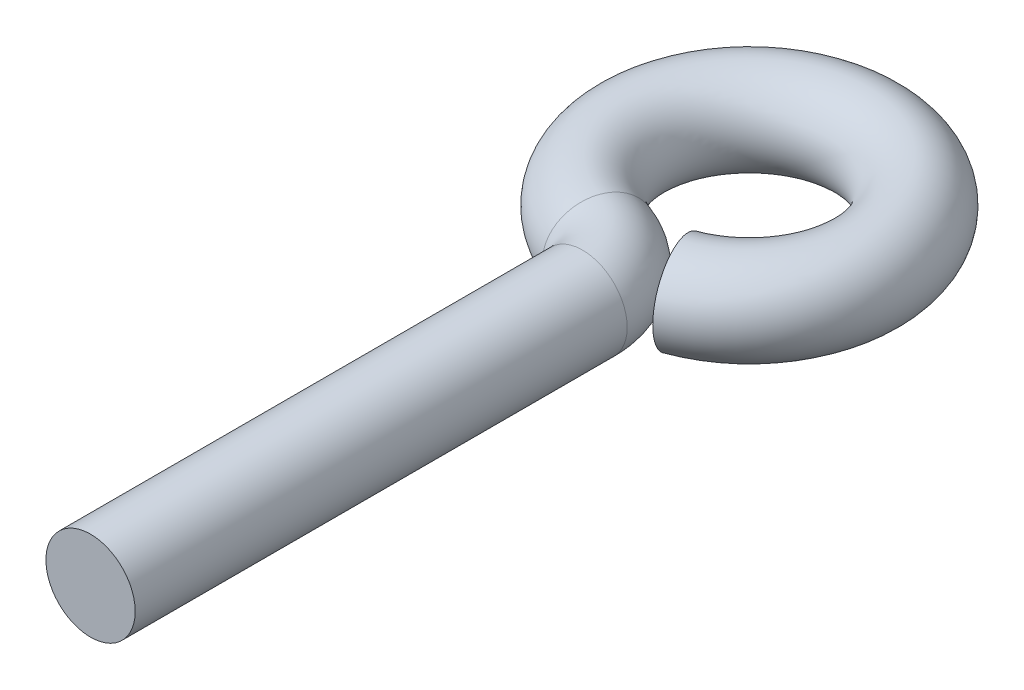
ISO-10303-21;
HEADER;
FILE_DESCRIPTION(('STEP AP214'),'2;1');
FILE_NAME('part.step','',(''),(''),'','','');
FILE_SCHEMA(('AUTOMOTIVE_DESIGN { 1 0 10303 214 1 1 1 1 }'));
ENDSEC;
DATA;
#1=APPLICATION_CONTEXT('core data for automotive mechanical design processes');
#2=APPLICATION_PROTOCOL_DEFINITION('international standard','automotive_design',2000,#1);
#3=PRODUCT_CONTEXT('',#1,'mechanical');
#4=PRODUCT('Part','Part','',(#3));
#5=PRODUCT_RELATED_PRODUCT_CATEGORY('part','',(#4));
#6=PRODUCT_DEFINITION_FORMATION('','',#4);
#7=PRODUCT_DEFINITION_CONTEXT('part definition',#1,'design');
#8=PRODUCT_DEFINITION('design','',#6,#7);
#9=PRODUCT_DEFINITION_SHAPE('','',#8);
#10=(LENGTH_UNIT() NAMED_UNIT(*) SI_UNIT(.MILLI.,.METRE.));
#11=(NAMED_UNIT(*) PLANE_ANGLE_UNIT() SI_UNIT($,.RADIAN.));
#12=(NAMED_UNIT(*) SI_UNIT($,.STERADIAN.) SOLID_ANGLE_UNIT());
#13=UNCERTAINTY_MEASURE_WITH_UNIT(LENGTH_MEASURE(1.E-05),#10,'distance_accuracy_value','');
#14=(GEOMETRIC_REPRESENTATION_CONTEXT(3) GLOBAL_UNCERTAINTY_ASSIGNED_CONTEXT((#13)) GLOBAL_UNIT_ASSIGNED_CONTEXT((#10,
#11,#12)) REPRESENTATION_CONTEXT('',''));
#15=CARTESIAN_POINT('',(0.,0.,0.));
#16=DIRECTION('',(0.,0.,1.));
#17=DIRECTION('',(1.,0.,0.));
#18=AXIS2_PLACEMENT_3D('',#15,#16,#17);
#19=CARTESIAN_POINT('',(1.65879769512947,0.,4.55750921081167));
#20=DIRECTION('',(0.93969262078591,0.,-0.342020143325663));
#21=DIRECTION('',(-0.342020143325663,0.,-0.93969262078591));
#22=AXIS2_PLACEMENT_3D('',#19,#20,#21);
#23=PLANE('',#22);
#24=CARTESIAN_POINT('',(1.65879769512947,0.,4.55750921081167));
#25=DIRECTION('',(0.93969262078591,0.,-0.342020143325663));
#26=DIRECTION('',(-0.342020143325663,0.,-0.93969262078591));
#27=AXIS2_PLACEMENT_3D('',#24,#25,#26);
#28=CIRCLE('',#27,1.85);
#29=CARTESIAN_POINT('',(2.29153496028195,0.,6.2959405592656));
#30=VERTEX_POINT('',#29);
#31=EDGE_CURVE('E46',#30,#30,#28,.T.);
#32=ORIENTED_EDGE('',*,*,#31,.F.);
#33=EDGE_LOOP('',(#32));
#34=FACE_BOUND('',#33,.T.);
#35=ADVANCED_FACE('F32',(#34),#23,.F.);
#36=CARTESIAN_POINT('',(0.,0.,27.3));
#37=DIRECTION('',(0.,0.,1.));
#38=DIRECTION('',(1.,0.,0.));
#39=AXIS2_PLACEMENT_3D('',#36,#37,#38);
#40=PLANE('',#39);
#41=CARTESIAN_POINT('',(0.,0.,27.3));
#42=DIRECTION('',(0.,0.,1.));
#43=DIRECTION('',(1.,0.,0.));
#44=AXIS2_PLACEMENT_3D('',#41,#42,#43);
#45=CIRCLE('',#44,1.85);
#46=CARTESIAN_POINT('',(1.85,0.,27.3));
#47=VERTEX_POINT('',#46);
#48=EDGE_CURVE('E10',#47,#47,#45,.T.);
#49=ORIENTED_EDGE('',*,*,#48,.T.);
#50=EDGE_LOOP('',(#49));
#51=FACE_BOUND('',#50,.T.);
#52=ADVANCED_FACE('F55',(#51),#40,.T.);
#53=CARTESIAN_POINT('',(0.,0.,0.));
#54=DIRECTION('',(0.,1.,0.));
#55=DIRECTION('',(0.,0.,1.));
#56=AXIS2_PLACEMENT_3D('',#53,#54,#55);
#57=TOROIDAL_SURFACE('',#56,4.85,1.85);
#58=CARTESIAN_POINT('',(-1.64965986394558,0.,4.56082474266301));
#59=DIRECTION('',(0.94037623560062,0.,0.340136054421769));
#60=DIRECTION('',(0.340136054421769,0.,-0.94037623560062));
#61=AXIS2_PLACEMENT_3D('',#58,#59,#60);
#62=CIRCLE('',#61,1.85);
#63=CARTESIAN_POINT('',(-2.27891156462585,0.,6.30052077852415));
#64=VERTEX_POINT('',#63);
#65=EDGE_CURVE('E42',#64,#64,#62,.T.);
#66=CARTESIAN_POINT('',(0.,0.,0.));
#67=DIRECTION('',(0.,1.,0.));
#68=DIRECTION('',(0.,0.,1.));
#69=AXIS2_PLACEMENT_3D('',#66,#67,#68);
#70=CIRCLE('',#69,6.7);
#71=EDGE_CURVE('',#30,#64,#70,.T.);
#72=ORIENTED_EDGE('',*,*,#31,.T.);
#73=ORIENTED_EDGE('',*,*,#65,.F.);
#74=ORIENTED_EDGE('',*,*,#71,.T.);
#75=ORIENTED_EDGE('',*,*,#71,.F.);
#76=EDGE_LOOP('',(#72,#74,#73,#75));
#77=FACE_BOUND('',#76,.T.);
#78=ADVANCED_FACE('F52',(#77),#57,.T.);
#79=CARTESIAN_POINT('',(-2.5,0.,6.91176533166455));
#80=DIRECTION('',(0.,-1.,0.));
#81=DIRECTION('',(0.,0.,-1.));
#82=AXIS2_PLACEMENT_3D('',#79,#80,#81);
#83=TOROIDAL_SURFACE('',#82,2.5,1.85);
#84=CARTESIAN_POINT('',(0.,0.,6.91176533166455));
#85=DIRECTION('',(0.,0.,1.));
#86=DIRECTION('',(1.,0.,0.));
#87=AXIS2_PLACEMENT_3D('',#84,#85,#86);
#88=CIRCLE('',#87,1.85);
#89=CARTESIAN_POINT('',(1.85,0.,6.91176533166455));
#90=VERTEX_POINT('',#89);
#91=EDGE_CURVE('E38',#90,#90,#88,.T.);
#92=ORIENTED_EDGE('',*,*,#91,.F.);
#93=EDGE_LOOP('',(#92));
#94=FACE_BOUND('',#93,.T.);
#95=ORIENTED_EDGE('',*,*,#65,.T.);
#96=EDGE_LOOP('',(#95));
#97=FACE_BOUND('',#96,.T.);
#98=ADVANCED_FACE('F61',(#94,#97),#83,.T.);
#99=CARTESIAN_POINT('',(0.,0.,6.91176533166455));
#100=DIRECTION('',(0.,0.,1.));
#101=DIRECTION('',(1.,0.,0.));
#102=AXIS2_PLACEMENT_3D('',#99,#100,#101);
#103=CYLINDRICAL_SURFACE('',#102,1.85);
#104=ORIENTED_EDGE('',*,*,#48,.F.);
#105=EDGE_LOOP('',(#104));
#106=FACE_BOUND('',#105,.T.);
#107=ORIENTED_EDGE('',*,*,#91,.T.);
#108=EDGE_LOOP('',(#107));
#109=FACE_BOUND('',#108,.T.);
#110=ADVANCED_FACE('F59',(#106,#109),#103,.T.);
#111=CLOSED_SHELL('',(#35,#52,#78,#98,#110));
#112=MANIFOLD_SOLID_BREP('B2',#111);
#113=ADVANCED_BREP_SHAPE_REPRESENTATION('',(#18,#112),#14);
#114=SHAPE_DEFINITION_REPRESENTATION(#9,#113);
ENDSEC;
END-ISO-10303-21;
